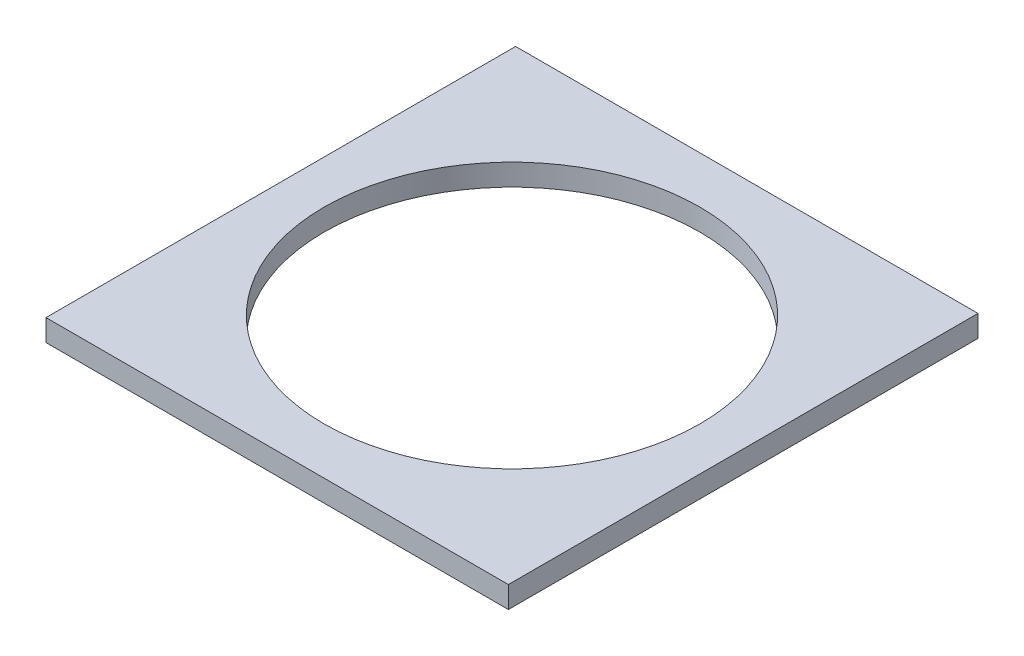
ISO-10303-21;
HEADER;
FILE_DESCRIPTION(('STEP AP214'),'2;1');
FILE_NAME('part.step','',(''),(''),'','','');
FILE_SCHEMA(('AUTOMOTIVE_DESIGN { 1 0 10303 214 1 1 1 1 }'));
ENDSEC;
DATA;
#1=APPLICATION_CONTEXT('core data for automotive mechanical design processes');
#2=APPLICATION_PROTOCOL_DEFINITION('international standard','automotive_design',2000,#1);
#3=PRODUCT_CONTEXT('',#1,'mechanical');
#4=PRODUCT('Part','Part','',(#3));
#5=PRODUCT_RELATED_PRODUCT_CATEGORY('part','',(#4));
#6=PRODUCT_DEFINITION_FORMATION('','',#4);
#7=PRODUCT_DEFINITION_CONTEXT('part definition',#1,'design');
#8=PRODUCT_DEFINITION('design','',#6,#7);
#9=PRODUCT_DEFINITION_SHAPE('','',#8);
#10=(LENGTH_UNIT() NAMED_UNIT(*) SI_UNIT(.MILLI.,.METRE.));
#11=(NAMED_UNIT(*) PLANE_ANGLE_UNIT() SI_UNIT($,.RADIAN.));
#12=(NAMED_UNIT(*) SI_UNIT($,.STERADIAN.) SOLID_ANGLE_UNIT());
#13=UNCERTAINTY_MEASURE_WITH_UNIT(LENGTH_MEASURE(1.E-05),#10,'distance_accuracy_value','');
#14=(GEOMETRIC_REPRESENTATION_CONTEXT(3) GLOBAL_UNCERTAINTY_ASSIGNED_CONTEXT((#13)) GLOBAL_UNIT_ASSIGNED_CONTEXT((#10,
#11,#12)) REPRESENTATION_CONTEXT('',''));
#15=CARTESIAN_POINT('',(0.,0.,0.));
#16=DIRECTION('',(0.,0.,1.));
#17=DIRECTION('',(1.,0.,0.));
#18=AXIS2_PLACEMENT_3D('',#15,#16,#17);
#19=CARTESIAN_POINT('',(0.,3.,0.));
#20=DIRECTION('',(0.,1.,0.));
#21=DIRECTION('',(0.,0.,1.));
#22=AXIS2_PLACEMENT_3D('',#19,#20,#21);
#23=PLANE('',#22);
#24=DIRECTION('',(1.,0.,0.));
#25=VECTOR('',#24,1.);
#26=CARTESIAN_POINT('',(-32.,3.,32.4999507791082));
#27=LINE('',#26,#25);
#28=CARTESIAN_POINT('',(-32.,3.,32.4999507791082));
#29=VERTEX_POINT('',#28);
#30=CARTESIAN_POINT('',(31.9999515712152,3.,32.4999507791082));
#31=VERTEX_POINT('',#30);
#32=EDGE_CURVE('E96',#29,#31,#27,.T.);
#33=ORIENTED_EDGE('',*,*,#32,.T.);
#34=DIRECTION('',(0.,0.,-1.));
#35=VECTOR('',#34,1.);
#36=CARTESIAN_POINT('',(31.9999515712152,3.,32.4999507791082));
#37=LINE('',#36,#35);
#38=CARTESIAN_POINT('',(31.9999515712152,3.,-32.5));
#39=VERTEX_POINT('',#38);
#40=EDGE_CURVE('E91',#31,#39,#37,.T.);
#41=ORIENTED_EDGE('',*,*,#40,.T.);
#42=DIRECTION('',(-1.,0.,0.));
#43=VECTOR('',#42,1.);
#44=CARTESIAN_POINT('',(31.9999515712152,3.,-32.5));
#45=LINE('',#44,#43);
#46=CARTESIAN_POINT('',(-32.,3.,-32.5));
#47=VERTEX_POINT('',#46);
#48=EDGE_CURVE('E94',#39,#47,#45,.T.);
#49=ORIENTED_EDGE('',*,*,#48,.T.);
#50=DIRECTION('',(0.,0.,1.));
#51=VECTOR('',#50,1.);
#52=CARTESIAN_POINT('',(-32.,3.,-32.5));
#53=LINE('',#52,#51);
#54=EDGE_CURVE('E61',#47,#29,#53,.T.);
#55=ORIENTED_EDGE('',*,*,#54,.T.);
#56=EDGE_LOOP('',(#33,#41,#49,#55));
#57=FACE_BOUND('',#56,.T.);
#58=CARTESIAN_POINT('',(0.,3.,0.));
#59=DIRECTION('',(0.,1.,0.));
#60=DIRECTION('',(0.,0.,1.));
#61=AXIS2_PLACEMENT_3D('',#58,#59,#60);
#62=CIRCLE('',#61,26.0000000000001);
#63=CARTESIAN_POINT('',(0.,3.,26.0000000000001));
#64=VERTEX_POINT('',#63);
#65=EDGE_CURVE('E116',#64,#64,#62,.T.);
#66=ORIENTED_EDGE('',*,*,#65,.F.);
#67=EDGE_LOOP('',(#66));
#68=FACE_BOUND('',#67,.T.);
#69=ADVANCED_FACE('F43',(#57,#68),#23,.T.);
#70=CARTESIAN_POINT('',(0.,0.,0.));
#71=DIRECTION('',(0.,1.,0.));
#72=DIRECTION('',(0.,0.,1.));
#73=AXIS2_PLACEMENT_3D('',#70,#71,#72);
#74=PLANE('',#73);
#75=DIRECTION('',(1.,0.,0.));
#76=VECTOR('',#75,1.);
#77=CARTESIAN_POINT('',(-32.,0.,32.4999507791082));
#78=LINE('',#77,#76);
#79=CARTESIAN_POINT('',(-32.,0.,32.4999507791082));
#80=VERTEX_POINT('',#79);
#81=CARTESIAN_POINT('',(31.9999515712152,0.,32.4999507791082));
#82=VERTEX_POINT('',#81);
#83=EDGE_CURVE('E112',#80,#82,#78,.T.);
#84=ORIENTED_EDGE('',*,*,#83,.F.);
#85=DIRECTION('',(0.,0.,1.));
#86=VECTOR('',#85,1.);
#87=CARTESIAN_POINT('',(-32.,0.,-32.5));
#88=LINE('',#87,#86);
#89=CARTESIAN_POINT('',(-32.,0.,-32.5));
#90=VERTEX_POINT('',#89);
#91=EDGE_CURVE('E84',#90,#80,#88,.T.);
#92=ORIENTED_EDGE('',*,*,#91,.F.);
#93=DIRECTION('',(-1.,0.,0.));
#94=VECTOR('',#93,1.);
#95=CARTESIAN_POINT('',(31.9999515712152,0.,-32.5));
#96=LINE('',#95,#94);
#97=CARTESIAN_POINT('',(31.9999515712152,0.,-32.5));
#98=VERTEX_POINT('',#97);
#99=EDGE_CURVE('E78',#98,#90,#96,.T.);
#100=ORIENTED_EDGE('',*,*,#99,.F.);
#101=DIRECTION('',(0.,0.,-1.));
#102=VECTOR('',#101,1.);
#103=CARTESIAN_POINT('',(31.9999515712152,0.,32.4999507791082));
#104=LINE('',#103,#102);
#105=EDGE_CURVE('E101',#82,#98,#104,.T.);
#106=ORIENTED_EDGE('',*,*,#105,.F.);
#107=EDGE_LOOP('',(#84,#92,#100,#106));
#108=FACE_BOUND('',#107,.T.);
#109=CARTESIAN_POINT('',(0.,0.,0.));
#110=DIRECTION('',(0.,1.,0.));
#111=DIRECTION('',(0.,0.,1.));
#112=AXIS2_PLACEMENT_3D('',#109,#110,#111);
#113=CIRCLE('',#112,26.0000000000001);
#114=CARTESIAN_POINT('',(0.,0.,26.0000000000001));
#115=VERTEX_POINT('',#114);
#116=EDGE_CURVE('E134',#115,#115,#113,.T.);
#117=ORIENTED_EDGE('',*,*,#116,.T.);
#118=EDGE_LOOP('',(#117));
#119=FACE_BOUND('',#118,.T.);
#120=ADVANCED_FACE('F129',(#108,#119),#74,.F.);
#121=CARTESIAN_POINT('',(-32.,3.,32.4999507791082));
#122=DIRECTION('',(0.,0.,-1.));
#123=DIRECTION('',(-1.,0.,0.));
#124=AXIS2_PLACEMENT_3D('',#121,#122,#123);
#125=PLANE('',#124);
#126=ORIENTED_EDGE('',*,*,#83,.T.);
#127=DIRECTION('',(0.,-1.,0.));
#128=VECTOR('',#127,1.);
#129=CARTESIAN_POINT('',(31.9999515712152,3.,32.4999507791082));
#130=LINE('',#129,#128);
#131=EDGE_CURVE('E11',#31,#82,#130,.T.);
#132=ORIENTED_EDGE('',*,*,#131,.F.);
#133=ORIENTED_EDGE('',*,*,#32,.F.);
#134=DIRECTION('',(0.,-1.,0.));
#135=VECTOR('',#134,1.);
#136=CARTESIAN_POINT('',(-32.,3.,32.4999507791082));
#137=LINE('',#136,#135);
#138=EDGE_CURVE('E108',#29,#80,#137,.T.);
#139=ORIENTED_EDGE('',*,*,#138,.T.);
#140=EDGE_LOOP('',(#126,#132,#133,#139));
#141=FACE_BOUND('',#140,.T.);
#142=ADVANCED_FACE('F45',(#141),#125,.F.);
#143=CARTESIAN_POINT('',(31.9999515712152,3.,32.4999507791082));
#144=DIRECTION('',(-1.,0.,0.));
#145=DIRECTION('',(0.,0.,1.));
#146=AXIS2_PLACEMENT_3D('',#143,#144,#145);
#147=PLANE('',#146);
#148=ORIENTED_EDGE('',*,*,#105,.T.);
#149=DIRECTION('',(0.,-1.,0.));
#150=VECTOR('',#149,1.);
#151=CARTESIAN_POINT('',(31.9999515712152,3.,-32.5));
#152=LINE('',#151,#150);
#153=EDGE_CURVE('E53',#39,#98,#152,.T.);
#154=ORIENTED_EDGE('',*,*,#153,.F.);
#155=ORIENTED_EDGE('',*,*,#40,.F.);
#156=ORIENTED_EDGE('',*,*,#131,.T.);
#157=EDGE_LOOP('',(#148,#154,#155,#156));
#158=FACE_BOUND('',#157,.T.);
#159=ADVANCED_FACE('F100',(#158),#147,.F.);
#160=CARTESIAN_POINT('',(31.9999515712152,3.,-32.5));
#161=DIRECTION('',(0.,0.,1.));
#162=DIRECTION('',(1.,0.,0.));
#163=AXIS2_PLACEMENT_3D('',#160,#161,#162);
#164=PLANE('',#163);
#165=ORIENTED_EDGE('',*,*,#99,.T.);
#166=DIRECTION('',(0.,-1.,0.));
#167=VECTOR('',#166,1.);
#168=CARTESIAN_POINT('',(-32.,3.,-32.5));
#169=LINE('',#168,#167);
#170=EDGE_CURVE('E103',#47,#90,#169,.T.);
#171=ORIENTED_EDGE('',*,*,#170,.F.);
#172=ORIENTED_EDGE('',*,*,#48,.F.);
#173=ORIENTED_EDGE('',*,*,#153,.T.);
#174=EDGE_LOOP('',(#165,#171,#172,#173));
#175=FACE_BOUND('',#174,.T.);
#176=ADVANCED_FACE('F104',(#175),#164,.F.);
#177=CARTESIAN_POINT('',(-32.,3.,-32.5));
#178=DIRECTION('',(1.,0.,0.));
#179=DIRECTION('',(0.,0.,-1.));
#180=AXIS2_PLACEMENT_3D('',#177,#178,#179);
#181=PLANE('',#180);
#182=ORIENTED_EDGE('',*,*,#91,.T.);
#183=ORIENTED_EDGE('',*,*,#138,.F.);
#184=ORIENTED_EDGE('',*,*,#54,.F.);
#185=ORIENTED_EDGE('',*,*,#170,.T.);
#186=EDGE_LOOP('',(#182,#183,#184,#185));
#187=FACE_BOUND('',#186,.T.);
#188=ADVANCED_FACE('F126',(#187),#181,.F.);
#189=CARTESIAN_POINT('',(0.,3.,0.));
#190=DIRECTION('',(0.,-1.,0.));
#191=DIRECTION('',(0.,0.,-1.));
#192=AXIS2_PLACEMENT_3D('',#189,#190,#191);
#193=CYLINDRICAL_SURFACE('',#192,26.0000000000001);
#194=ORIENTED_EDGE('',*,*,#65,.T.);
#195=EDGE_LOOP('',(#194));
#196=FACE_BOUND('',#195,.T.);
#197=ORIENTED_EDGE('',*,*,#116,.F.);
#198=EDGE_LOOP('',(#197));
#199=FACE_BOUND('',#198,.T.);
#200=ADVANCED_FACE('F142',(#196,#199),#193,.F.);
#201=CLOSED_SHELL('',(#69,#120,#142,#159,#176,#188,#200));
#202=MANIFOLD_SOLID_BREP('B2',#201);
#203=ADVANCED_BREP_SHAPE_REPRESENTATION('',(#18,#202),#14);
#204=SHAPE_DEFINITION_REPRESENTATION(#9,#203);
ENDSEC;
END-ISO-10303-21;
